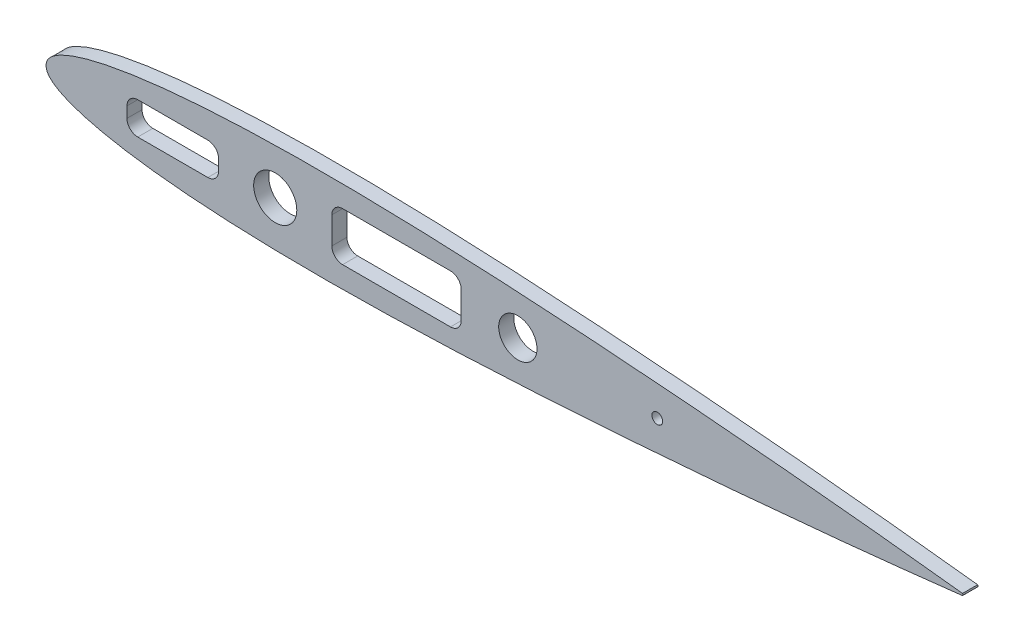
ISO-10303-21;
HEADER;
FILE_DESCRIPTION(('STEP AP214'),'2;1');
FILE_NAME('part.step','',(''),(''),'','','');
FILE_SCHEMA(('AUTOMOTIVE_DESIGN { 1 0 10303 214 1 1 1 1 }'));
ENDSEC;
DATA;
#1=APPLICATION_CONTEXT('core data for automotive mechanical design processes');
#2=APPLICATION_PROTOCOL_DEFINITION('international standard','automotive_design',2000,#1);
#3=PRODUCT_CONTEXT('',#1,'mechanical');
#4=PRODUCT('Part','Part','',(#3));
#5=PRODUCT_RELATED_PRODUCT_CATEGORY('part','',(#4));
#6=PRODUCT_DEFINITION_FORMATION('','',#4);
#7=PRODUCT_DEFINITION_CONTEXT('part definition',#1,'design');
#8=PRODUCT_DEFINITION('design','',#6,#7);
#9=PRODUCT_DEFINITION_SHAPE('','',#8);
#10=(LENGTH_UNIT() NAMED_UNIT(*) SI_UNIT(.MILLI.,.METRE.));
#11=(NAMED_UNIT(*) PLANE_ANGLE_UNIT() SI_UNIT($,.RADIAN.));
#12=(NAMED_UNIT(*) SI_UNIT($,.STERADIAN.) SOLID_ANGLE_UNIT());
#13=UNCERTAINTY_MEASURE_WITH_UNIT(LENGTH_MEASURE(1.E-05),#10,'distance_accuracy_value','');
#14=(GEOMETRIC_REPRESENTATION_CONTEXT(3) GLOBAL_UNCERTAINTY_ASSIGNED_CONTEXT((#13)) GLOBAL_UNIT_ASSIGNED_CONTEXT((#10,
#11,#12)) REPRESENTATION_CONTEXT('',''));
#15=CARTESIAN_POINT('',(0.,0.,0.));
#16=DIRECTION('',(0.,0.,1.));
#17=DIRECTION('',(1.,0.,0.));
#18=AXIS2_PLACEMENT_3D('',#15,#16,#17);
#19=CARTESIAN_POINT('',(163.018484280221,0.,1.4));
#20=DIRECTION('',(-1.,0.,0.));
#21=DIRECTION('',(0.,0.,1.));
#22=AXIS2_PLACEMENT_3D('',#19,#20,#21);
#23=PLANE('',#22);
#24=DIRECTION('',(0.,1.,0.));
#25=VECTOR('',#24,1.);
#26=CARTESIAN_POINT('',(163.018484280221,0.,-1.4));
#27=LINE('',#26,#25);
#28=CARTESIAN_POINT('',(163.018484280221,-2.5,-1.4));
#29=VERTEX_POINT('',#28);
#30=CARTESIAN_POINT('',(163.018484280221,2.5,-1.4));
#31=VERTEX_POINT('',#30);
#32=EDGE_CURVE('E250',#29,#31,#27,.T.);
#33=ORIENTED_EDGE('',*,*,#32,.T.);
#34=DIRECTION('',(0.,0.,-1.));
#35=VECTOR('',#34,1.);
#36=CARTESIAN_POINT('',(163.018484280221,2.5,1.4));
#37=LINE('',#36,#35);
#38=CARTESIAN_POINT('',(163.018484280221,2.5,1.4));
#39=VERTEX_POINT('',#38);
#40=EDGE_CURVE('E11',#39,#31,#37,.T.);
#41=ORIENTED_EDGE('',*,*,#40,.F.);
#42=DIRECTION('',(0.,1.,0.));
#43=VECTOR('',#42,1.);
#44=CARTESIAN_POINT('',(163.018484280221,0.,1.4));
#45=LINE('',#44,#43);
#46=CARTESIAN_POINT('',(163.018484280221,-2.5,1.4));
#47=VERTEX_POINT('',#46);
#48=EDGE_CURVE('E426',#47,#39,#45,.T.);
#49=ORIENTED_EDGE('',*,*,#48,.F.);
#50=DIRECTION('',(0.,0.,-1.));
#51=VECTOR('',#50,1.);
#52=CARTESIAN_POINT('',(163.018484280221,-2.5,1.4));
#53=LINE('',#52,#51);
#54=EDGE_CURVE('E276',#47,#29,#53,.T.);
#55=ORIENTED_EDGE('',*,*,#54,.T.);
#56=EDGE_LOOP('',(#33,#41,#49,#55));
#57=FACE_BOUND('',#56,.T.);
#58=ADVANCED_FACE('F35',(#57),#23,.F.);
#59=CARTESIAN_POINT('',(165.018484280221,2.5,1.4));
#60=DIRECTION('',(0.,0.,-1.));
#61=DIRECTION('',(-1.,0.,0.));
#62=AXIS2_PLACEMENT_3D('',#59,#60,#61);
#63=CYLINDRICAL_SURFACE('',#62,2.);
#64=CARTESIAN_POINT('',(165.018484280221,2.5,-1.4));
#65=DIRECTION('',(0.,0.,1.));
#66=DIRECTION('',(1.,0.,0.));
#67=AXIS2_PLACEMENT_3D('',#64,#65,#66);
#68=CIRCLE('',#67,2.);
#69=CARTESIAN_POINT('',(165.018484280221,4.5,-1.4));
#70=VERTEX_POINT('',#69);
#71=EDGE_CURVE('E253',#31,#70,#68,.F.);
#72=ORIENTED_EDGE('',*,*,#71,.T.);
#73=DIRECTION('',(0.,0.,-1.));
#74=VECTOR('',#73,1.);
#75=CARTESIAN_POINT('',(165.018484280221,4.5,1.4));
#76=LINE('',#75,#74);
#77=CARTESIAN_POINT('',(165.018484280221,4.5,1.4));
#78=VERTEX_POINT('',#77);
#79=EDGE_CURVE('E46',#78,#70,#76,.T.);
#80=ORIENTED_EDGE('',*,*,#79,.F.);
#81=CARTESIAN_POINT('',(165.018484280221,2.5,1.4));
#82=DIRECTION('',(0.,0.,1.));
#83=DIRECTION('',(1.,0.,0.));
#84=AXIS2_PLACEMENT_3D('',#81,#82,#83);
#85=CIRCLE('',#84,2.);
#86=EDGE_CURVE('E428',#39,#78,#85,.F.);
#87=ORIENTED_EDGE('',*,*,#86,.F.);
#88=ORIENTED_EDGE('',*,*,#40,.T.);
#89=EDGE_LOOP('',(#72,#80,#87,#88));
#90=FACE_BOUND('',#89,.T.);
#91=ADVANCED_FACE('F360',(#90),#63,.F.);
#92=CARTESIAN_POINT('',(0.,4.5,1.4));
#93=DIRECTION('',(0.,1.,0.));
#94=DIRECTION('',(0.,0.,1.));
#95=AXIS2_PLACEMENT_3D('',#92,#93,#94);
#96=PLANE('',#95);
#97=DIRECTION('',(1.,0.,0.));
#98=VECTOR('',#97,1.);
#99=CARTESIAN_POINT('',(0.,4.5,-1.4));
#100=LINE('',#99,#98);
#101=CARTESIAN_POINT('',(185.018484280221,4.5,-1.4));
#102=VERTEX_POINT('',#101);
#103=EDGE_CURVE('E255',#70,#102,#100,.T.);
#104=ORIENTED_EDGE('',*,*,#103,.T.);
#105=DIRECTION('',(0.,0.,-1.));
#106=VECTOR('',#105,1.);
#107=CARTESIAN_POINT('',(185.018484280221,4.5,1.4));
#108=LINE('',#107,#106);
#109=CARTESIAN_POINT('',(185.018484280221,4.5,1.4));
#110=VERTEX_POINT('',#109);
#111=EDGE_CURVE('E283',#110,#102,#108,.T.);
#112=ORIENTED_EDGE('',*,*,#111,.F.);
#113=DIRECTION('',(1.,0.,0.));
#114=VECTOR('',#113,1.);
#115=CARTESIAN_POINT('',(0.,4.5,1.4));
#116=LINE('',#115,#114);
#117=EDGE_CURVE('E430',#78,#110,#116,.T.);
#118=ORIENTED_EDGE('',*,*,#117,.F.);
#119=ORIENTED_EDGE('',*,*,#79,.T.);
#120=EDGE_LOOP('',(#104,#112,#118,#119));
#121=FACE_BOUND('',#120,.T.);
#122=ADVANCED_FACE('F366',(#121),#96,.F.);
#123=CARTESIAN_POINT('',(185.018484280221,2.5,1.4));
#124=DIRECTION('',(0.,0.,-1.));
#125=DIRECTION('',(-1.,0.,0.));
#126=AXIS2_PLACEMENT_3D('',#123,#124,#125);
#127=CYLINDRICAL_SURFACE('',#126,2.);
#128=CARTESIAN_POINT('',(185.018484280221,2.5,-1.4));
#129=DIRECTION('',(0.,0.,1.));
#130=DIRECTION('',(1.,0.,0.));
#131=AXIS2_PLACEMENT_3D('',#128,#129,#130);
#132=CIRCLE('',#131,2.);
#133=CARTESIAN_POINT('',(187.018484280221,2.5,-1.4));
#134=VERTEX_POINT('',#133);
#135=EDGE_CURVE('E257',#102,#134,#132,.F.);
#136=ORIENTED_EDGE('',*,*,#135,.T.);
#137=DIRECTION('',(0.,0.,-1.));
#138=VECTOR('',#137,1.);
#139=CARTESIAN_POINT('',(187.018484280221,2.5,1.4));
#140=LINE('',#139,#138);
#141=CARTESIAN_POINT('',(187.018484280221,2.5,1.4));
#142=VERTEX_POINT('',#141);
#143=EDGE_CURVE('E281',#142,#134,#140,.T.);
#144=ORIENTED_EDGE('',*,*,#143,.F.);
#145=CARTESIAN_POINT('',(185.018484280221,2.5,1.4));
#146=DIRECTION('',(0.,0.,1.));
#147=DIRECTION('',(1.,0.,0.));
#148=AXIS2_PLACEMENT_3D('',#145,#146,#147);
#149=CIRCLE('',#148,2.);
#150=EDGE_CURVE('E432',#110,#142,#149,.F.);
#151=ORIENTED_EDGE('',*,*,#150,.F.);
#152=ORIENTED_EDGE('',*,*,#111,.T.);
#153=EDGE_LOOP('',(#136,#144,#151,#152));
#154=FACE_BOUND('',#153,.T.);
#155=ADVANCED_FACE('F457',(#154),#127,.F.);
#156=CARTESIAN_POINT('',(187.018484280221,0.,1.4));
#157=DIRECTION('',(-1.,0.,0.));
#158=DIRECTION('',(0.,0.,1.));
#159=AXIS2_PLACEMENT_3D('',#156,#157,#158);
#160=PLANE('',#159);
#161=DIRECTION('',(0.,1.,0.));
#162=VECTOR('',#161,1.);
#163=CARTESIAN_POINT('',(187.018484280221,0.,-1.4));
#164=LINE('',#163,#162);
#165=CARTESIAN_POINT('',(187.018484280221,-2.5,-1.4));
#166=VERTEX_POINT('',#165);
#167=EDGE_CURVE('E260',#166,#134,#164,.T.);
#168=ORIENTED_EDGE('',*,*,#167,.F.);
#169=DIRECTION('',(0.,0.,-1.));
#170=VECTOR('',#169,1.);
#171=CARTESIAN_POINT('',(187.018484280221,-2.5,1.4));
#172=LINE('',#171,#170);
#173=CARTESIAN_POINT('',(187.018484280221,-2.5,1.4));
#174=VERTEX_POINT('',#173);
#175=EDGE_CURVE('E187',#174,#166,#172,.T.);
#176=ORIENTED_EDGE('',*,*,#175,.F.);
#177=DIRECTION('',(0.,1.,0.));
#178=VECTOR('',#177,1.);
#179=CARTESIAN_POINT('',(187.018484280221,0.,1.4));
#180=LINE('',#179,#178);
#181=EDGE_CURVE('E194',#174,#142,#180,.T.);
#182=ORIENTED_EDGE('',*,*,#181,.T.);
#183=ORIENTED_EDGE('',*,*,#143,.T.);
#184=EDGE_LOOP('',(#168,#176,#182,#183));
#185=FACE_BOUND('',#184,.T.);
#186=ADVANCED_FACE('F435',(#185),#160,.T.);
#187=CARTESIAN_POINT('',(185.018484280221,-2.5,1.4));
#188=DIRECTION('',(0.,0.,-1.));
#189=DIRECTION('',(-1.,0.,0.));
#190=AXIS2_PLACEMENT_3D('',#187,#188,#189);
#191=CYLINDRICAL_SURFACE('',#190,2.);
#192=CARTESIAN_POINT('',(185.018484280221,-2.5,-1.4));
#193=DIRECTION('',(0.,0.,1.));
#194=DIRECTION('',(1.,0.,0.));
#195=AXIS2_PLACEMENT_3D('',#192,#193,#194);
#196=CIRCLE('',#195,2.);
#197=CARTESIAN_POINT('',(185.018484280221,-4.5,-1.4));
#198=VERTEX_POINT('',#197);
#199=EDGE_CURVE('E182',#198,#166,#196,.T.);
#200=ORIENTED_EDGE('',*,*,#199,.F.);
#201=DIRECTION('',(0.,0.,-1.));
#202=VECTOR('',#201,1.);
#203=CARTESIAN_POINT('',(185.018484280221,-4.5,1.4));
#204=LINE('',#203,#202);
#205=CARTESIAN_POINT('',(185.018484280221,-4.5,1.4));
#206=VERTEX_POINT('',#205);
#207=EDGE_CURVE('E177',#206,#198,#204,.T.);
#208=ORIENTED_EDGE('',*,*,#207,.F.);
#209=CARTESIAN_POINT('',(185.018484280221,-2.5,1.4));
#210=DIRECTION('',(0.,0.,1.));
#211=DIRECTION('',(1.,0.,0.));
#212=AXIS2_PLACEMENT_3D('',#209,#210,#211);
#213=CIRCLE('',#212,2.);
#214=EDGE_CURVE('E180',#206,#174,#213,.T.);
#215=ORIENTED_EDGE('',*,*,#214,.T.);
#216=ORIENTED_EDGE('',*,*,#175,.T.);
#217=EDGE_LOOP('',(#200,#208,#215,#216));
#218=FACE_BOUND('',#217,.T.);
#219=ADVANCED_FACE('F179',(#218),#191,.F.);
#220=CARTESIAN_POINT('',(0.,-4.5,1.4));
#221=DIRECTION('',(0.,1.,0.));
#222=DIRECTION('',(0.,0.,1.));
#223=AXIS2_PLACEMENT_3D('',#220,#221,#222);
#224=PLANE('',#223);
#225=DIRECTION('',(1.,0.,0.));
#226=VECTOR('',#225,1.);
#227=CARTESIAN_POINT('',(0.,-4.5,-1.4));
#228=LINE('',#227,#226);
#229=CARTESIAN_POINT('',(165.018484280221,-4.5,-1.4));
#230=VERTEX_POINT('',#229);
#231=EDGE_CURVE('E264',#230,#198,#228,.T.);
#232=ORIENTED_EDGE('',*,*,#231,.F.);
#233=DIRECTION('',(0.,0.,-1.));
#234=VECTOR('',#233,1.);
#235=CARTESIAN_POINT('',(165.018484280221,-4.5,1.4));
#236=LINE('',#235,#234);
#237=CARTESIAN_POINT('',(165.018484280221,-4.5,1.4));
#238=VERTEX_POINT('',#237);
#239=EDGE_CURVE('E116',#238,#230,#236,.T.);
#240=ORIENTED_EDGE('',*,*,#239,.F.);
#241=DIRECTION('',(1.,0.,0.));
#242=VECTOR('',#241,1.);
#243=CARTESIAN_POINT('',(0.,-4.5,1.4));
#244=LINE('',#243,#242);
#245=EDGE_CURVE('E192',#238,#206,#244,.T.);
#246=ORIENTED_EDGE('',*,*,#245,.T.);
#247=ORIENTED_EDGE('',*,*,#207,.T.);
#248=EDGE_LOOP('',(#232,#240,#246,#247));
#249=FACE_BOUND('',#248,.T.);
#250=ADVANCED_FACE('F196',(#249),#224,.T.);
#251=CARTESIAN_POINT('',(0.,3.,1.4));
#252=DIRECTION('',(0.,1.,0.));
#253=DIRECTION('',(0.,0.,1.));
#254=AXIS2_PLACEMENT_3D('',#251,#252,#253);
#255=PLANE('',#254);
#256=DIRECTION('',(1.,0.,0.));
#257=VECTOR('',#256,1.);
#258=CARTESIAN_POINT('',(0.,3.,-1.4));
#259=LINE('',#258,#257);
#260=CARTESIAN_POINT('',(127.018484280221,3.,-1.4));
#261=VERTEX_POINT('',#260);
#262=CARTESIAN_POINT('',(140.018484280221,3.,-1.4));
#263=VERTEX_POINT('',#262);
#264=EDGE_CURVE('E226',#261,#263,#259,.T.);
#265=ORIENTED_EDGE('',*,*,#264,.T.);
#266=DIRECTION('',(0.,0.,-1.));
#267=VECTOR('',#266,1.);
#268=CARTESIAN_POINT('',(140.018484280221,3.,1.4));
#269=LINE('',#268,#267);
#270=CARTESIAN_POINT('',(140.018484280221,3.,1.4));
#271=VERTEX_POINT('',#270);
#272=EDGE_CURVE('E278',#271,#263,#269,.T.);
#273=ORIENTED_EDGE('',*,*,#272,.F.);
#274=DIRECTION('',(1.,0.,0.));
#275=VECTOR('',#274,1.);
#276=CARTESIAN_POINT('',(0.,3.,1.4));
#277=LINE('',#276,#275);
#278=CARTESIAN_POINT('',(127.018484280221,3.,1.4));
#279=VERTEX_POINT('',#278);
#280=EDGE_CURVE('E337',#279,#271,#277,.T.);
#281=ORIENTED_EDGE('',*,*,#280,.F.);
#282=DIRECTION('',(0.,0.,-1.));
#283=VECTOR('',#282,1.);
#284=CARTESIAN_POINT('',(127.018484280221,3.,1.4));
#285=LINE('',#284,#283);
#286=EDGE_CURVE('E288',#279,#261,#285,.T.);
#287=ORIENTED_EDGE('',*,*,#286,.T.);
#288=EDGE_LOOP('',(#265,#273,#281,#287));
#289=FACE_BOUND('',#288,.T.);
#290=ADVANCED_FACE('F347',(#289),#255,.F.);
#291=CARTESIAN_POINT('',(140.018484280221,1.,1.4));
#292=DIRECTION('',(0.,0.,-1.));
#293=DIRECTION('',(-1.,0.,0.));
#294=AXIS2_PLACEMENT_3D('',#291,#292,#293);
#295=CYLINDRICAL_SURFACE('',#294,2.);
#296=CARTESIAN_POINT('',(140.018484280221,1.,-1.4));
#297=DIRECTION('',(0.,0.,1.));
#298=DIRECTION('',(1.,0.,0.));
#299=AXIS2_PLACEMENT_3D('',#296,#297,#298);
#300=CIRCLE('',#299,2.);
#301=CARTESIAN_POINT('',(142.018484280221,0.999999999999986,-1.4));
#302=VERTEX_POINT('',#301);
#303=EDGE_CURVE('E232',#263,#302,#300,.F.);
#304=ORIENTED_EDGE('',*,*,#303,.T.);
#305=DIRECTION('',(0.,0.,-1.));
#306=VECTOR('',#305,1.);
#307=CARTESIAN_POINT('',(142.018484280221,0.999999999999986,1.4));
#308=LINE('',#307,#306);
#309=CARTESIAN_POINT('',(142.018484280221,0.999999999999986,1.4));
#310=VERTEX_POINT('',#309);
#311=EDGE_CURVE('E303',#310,#302,#308,.T.);
#312=ORIENTED_EDGE('',*,*,#311,.F.);
#313=CARTESIAN_POINT('',(140.018484280221,1.,1.4));
#314=DIRECTION('',(0.,0.,1.));
#315=DIRECTION('',(1.,0.,0.));
#316=AXIS2_PLACEMENT_3D('',#313,#314,#315);
#317=CIRCLE('',#316,2.);
#318=EDGE_CURVE('E413',#271,#310,#317,.F.);
#319=ORIENTED_EDGE('',*,*,#318,.F.);
#320=ORIENTED_EDGE('',*,*,#272,.T.);
#321=EDGE_LOOP('',(#304,#312,#319,#320));
#322=FACE_BOUND('',#321,.T.);
#323=ADVANCED_FACE('F392',(#322),#295,.F.);
#324=CARTESIAN_POINT('',(142.018484280221,0.,1.4));
#325=DIRECTION('',(-1.,0.,0.));
#326=DIRECTION('',(0.,0.,1.));
#327=AXIS2_PLACEMENT_3D('',#324,#325,#326);
#328=PLANE('',#327);
#329=DIRECTION('',(0.,1.,0.));
#330=VECTOR('',#329,1.);
#331=CARTESIAN_POINT('',(142.018484280221,0.,-1.4));
#332=LINE('',#331,#330);
#333=CARTESIAN_POINT('',(142.018484280221,-0.999999999999985,-1.4));
#334=VERTEX_POINT('',#333);
#335=EDGE_CURVE('E235',#334,#302,#332,.T.);
#336=ORIENTED_EDGE('',*,*,#335,.F.);
#337=DIRECTION('',(0.,0.,-1.));
#338=VECTOR('',#337,1.);
#339=CARTESIAN_POINT('',(142.018484280221,-0.999999999999985,1.4));
#340=LINE('',#339,#338);
#341=CARTESIAN_POINT('',(142.018484280221,-0.999999999999985,1.4));
#342=VERTEX_POINT('',#341);
#343=EDGE_CURVE('E301',#342,#334,#340,.T.);
#344=ORIENTED_EDGE('',*,*,#343,.F.);
#345=DIRECTION('',(0.,1.,0.));
#346=VECTOR('',#345,1.);
#347=CARTESIAN_POINT('',(142.018484280221,0.,1.4));
#348=LINE('',#347,#346);
#349=EDGE_CURVE('E408',#342,#310,#348,.T.);
#350=ORIENTED_EDGE('',*,*,#349,.T.);
#351=ORIENTED_EDGE('',*,*,#311,.T.);
#352=EDGE_LOOP('',(#336,#344,#350,#351));
#353=FACE_BOUND('',#352,.T.);
#354=ADVANCED_FACE('F389',(#353),#328,.T.);
#355=CARTESIAN_POINT('',(140.018484280221,-1.,1.4));
#356=DIRECTION('',(0.,0.,-1.));
#357=DIRECTION('',(-1.,0.,0.));
#358=AXIS2_PLACEMENT_3D('',#355,#356,#357);
#359=CYLINDRICAL_SURFACE('',#358,2.);
#360=CARTESIAN_POINT('',(140.018484280221,-1.,-1.4));
#361=DIRECTION('',(0.,0.,1.));
#362=DIRECTION('',(1.,0.,0.));
#363=AXIS2_PLACEMENT_3D('',#360,#361,#362);
#364=CIRCLE('',#363,2.);
#365=CARTESIAN_POINT('',(140.018484280221,-3.,-1.4));
#366=VERTEX_POINT('',#365);
#367=EDGE_CURVE('E238',#366,#334,#364,.T.);
#368=ORIENTED_EDGE('',*,*,#367,.F.);
#369=DIRECTION('',(0.,0.,-1.));
#370=VECTOR('',#369,1.);
#371=CARTESIAN_POINT('',(140.018484280221,-3.,1.4));
#372=LINE('',#371,#370);
#373=CARTESIAN_POINT('',(140.018484280221,-3.,1.4));
#374=VERTEX_POINT('',#373);
#375=EDGE_CURVE('E299',#374,#366,#372,.T.);
#376=ORIENTED_EDGE('',*,*,#375,.F.);
#377=CARTESIAN_POINT('',(140.018484280221,-1.,1.4));
#378=DIRECTION('',(0.,0.,1.));
#379=DIRECTION('',(1.,0.,0.));
#380=AXIS2_PLACEMENT_3D('',#377,#378,#379);
#381=CIRCLE('',#380,2.);
#382=EDGE_CURVE('E412',#374,#342,#381,.T.);
#383=ORIENTED_EDGE('',*,*,#382,.T.);
#384=ORIENTED_EDGE('',*,*,#343,.T.);
#385=EDGE_LOOP('',(#368,#376,#383,#384));
#386=FACE_BOUND('',#385,.T.);
#387=ADVANCED_FACE('F385',(#386),#359,.F.);
#388=CARTESIAN_POINT('',(0.,-3.,1.4));
#389=DIRECTION('',(0.,1.,0.));
#390=DIRECTION('',(0.,0.,1.));
#391=AXIS2_PLACEMENT_3D('',#388,#389,#390);
#392=PLANE('',#391);
#393=DIRECTION('',(1.,0.,0.));
#394=VECTOR('',#393,1.);
#395=CARTESIAN_POINT('',(0.,-3.,-1.4));
#396=LINE('',#395,#394);
#397=CARTESIAN_POINT('',(127.018484280221,-3.,-1.4));
#398=VERTEX_POINT('',#397);
#399=EDGE_CURVE('E241',#398,#366,#396,.T.);
#400=ORIENTED_EDGE('',*,*,#399,.F.);
#401=DIRECTION('',(0.,0.,-1.));
#402=VECTOR('',#401,1.);
#403=CARTESIAN_POINT('',(127.018484280221,-3.,1.4));
#404=LINE('',#403,#402);
#405=CARTESIAN_POINT('',(127.018484280221,-3.,1.4));
#406=VERTEX_POINT('',#405);
#407=EDGE_CURVE('E297',#406,#398,#404,.T.);
#408=ORIENTED_EDGE('',*,*,#407,.F.);
#409=DIRECTION('',(1.,0.,0.));
#410=VECTOR('',#409,1.);
#411=CARTESIAN_POINT('',(0.,-3.,1.4));
#412=LINE('',#411,#410);
#413=EDGE_CURVE('E415',#406,#374,#412,.T.);
#414=ORIENTED_EDGE('',*,*,#413,.T.);
#415=ORIENTED_EDGE('',*,*,#375,.T.);
#416=EDGE_LOOP('',(#400,#408,#414,#415));
#417=FACE_BOUND('',#416,.T.);
#418=ADVANCED_FACE('F381',(#417),#392,.T.);
#419=CARTESIAN_POINT('',(127.018484280221,-1.,1.4));
#420=DIRECTION('',(0.,0.,-1.));
#421=DIRECTION('',(-1.,0.,0.));
#422=AXIS2_PLACEMENT_3D('',#419,#420,#421);
#423=CYLINDRICAL_SURFACE('',#422,2.);
#424=CARTESIAN_POINT('',(127.018484280221,-1.,-1.4));
#425=DIRECTION('',(0.,0.,1.));
#426=DIRECTION('',(1.,0.,0.));
#427=AXIS2_PLACEMENT_3D('',#424,#425,#426);
#428=CIRCLE('',#427,2.);
#429=CARTESIAN_POINT('',(125.018484280221,-0.999999999999985,-1.4));
#430=VERTEX_POINT('',#429);
#431=EDGE_CURVE('E244',#398,#430,#428,.F.);
#432=ORIENTED_EDGE('',*,*,#431,.T.);
#433=DIRECTION('',(0.,0.,-1.));
#434=VECTOR('',#433,1.);
#435=CARTESIAN_POINT('',(125.018484280221,-0.999999999999985,1.4));
#436=LINE('',#435,#434);
#437=CARTESIAN_POINT('',(125.018484280221,-0.999999999999985,1.4));
#438=VERTEX_POINT('',#437);
#439=EDGE_CURVE('E294',#438,#430,#436,.T.);
#440=ORIENTED_EDGE('',*,*,#439,.F.);
#441=CARTESIAN_POINT('',(127.018484280221,-1.,1.4));
#442=DIRECTION('',(0.,0.,1.));
#443=DIRECTION('',(1.,0.,0.));
#444=AXIS2_PLACEMENT_3D('',#441,#442,#443);
#445=CIRCLE('',#444,2.);
#446=EDGE_CURVE('E420',#406,#438,#445,.F.);
#447=ORIENTED_EDGE('',*,*,#446,.F.);
#448=ORIENTED_EDGE('',*,*,#407,.T.);
#449=EDGE_LOOP('',(#432,#440,#447,#448));
#450=FACE_BOUND('',#449,.T.);
#451=ADVANCED_FACE('F377',(#450),#423,.F.);
#452=CARTESIAN_POINT('',(125.018484280221,0.,1.4));
#453=DIRECTION('',(-1.,0.,0.));
#454=DIRECTION('',(0.,0.,1.));
#455=AXIS2_PLACEMENT_3D('',#452,#453,#454);
#456=PLANE('',#455);
#457=DIRECTION('',(0.,1.,0.));
#458=VECTOR('',#457,1.);
#459=CARTESIAN_POINT('',(125.018484280221,0.,-1.4));
#460=LINE('',#459,#458);
#461=CARTESIAN_POINT('',(125.018484280221,0.999999999999986,-1.4));
#462=VERTEX_POINT('',#461);
#463=EDGE_CURVE('E246',#430,#462,#460,.T.);
#464=ORIENTED_EDGE('',*,*,#463,.T.);
#465=DIRECTION('',(0.,0.,-1.));
#466=VECTOR('',#465,1.);
#467=CARTESIAN_POINT('',(125.018484280221,0.999999999999986,1.4));
#468=LINE('',#467,#466);
#469=CARTESIAN_POINT('',(125.018484280221,0.999999999999986,1.4));
#470=VERTEX_POINT('',#469);
#471=EDGE_CURVE('E291',#470,#462,#468,.T.);
#472=ORIENTED_EDGE('',*,*,#471,.F.);
#473=DIRECTION('',(0.,1.,0.));
#474=VECTOR('',#473,1.);
#475=CARTESIAN_POINT('',(125.018484280221,0.,1.4));
#476=LINE('',#475,#474);
#477=EDGE_CURVE('E422',#438,#470,#476,.T.);
#478=ORIENTED_EDGE('',*,*,#477,.F.);
#479=ORIENTED_EDGE('',*,*,#439,.T.);
#480=EDGE_LOOP('',(#464,#472,#478,#479));
#481=FACE_BOUND('',#480,.T.);
#482=ADVANCED_FACE('F358',(#481),#456,.F.);
#483=CARTESIAN_POINT('',(110.,0.,1.4));
#484=CARTESIAN_POINT('',(110.027578175867,-0.236721440142772,1.4));
#485=CARTESIAN_POINT('',(110.085538217979,-0.734230220465975,1.4));
#486=CARTESIAN_POINT('',(110.530223641577,-1.42706975809109,1.4));
#487=CARTESIAN_POINT('',(111.196336340545,-2.07855523302878,1.4));
#488=CARTESIAN_POINT('',(112.109835923497,-2.70130638754161,1.4));
#489=CARTESIAN_POINT('',(113.256788366372,-3.29930923783809,1.4));
#490=CARTESIAN_POINT('',(114.637939719778,-3.87306046577258,1.4));
#491=CARTESIAN_POINT('',(116.24766579781,-4.42139238611828,1.4));
#492=CARTESIAN_POINT('',(118.081312132678,-4.94256764101073,1.4));
#493=CARTESIAN_POINT('',(120.133109351335,-5.43479747619412,1.4));
#494=CARTESIAN_POINT('',(122.397158973637,-5.89612056643677,1.4));
#495=CARTESIAN_POINT('',(124.867245825052,-6.32466607739586,1.4));
#496=CARTESIAN_POINT('',(127.536961088608,-6.71865034112428,1.4));
#497=CARTESIAN_POINT('',(130.399721685833,-7.07642431038863,1.4));
#498=CARTESIAN_POINT('',(133.44876289533,-7.39648056861162,1.4));
#499=CARTESIAN_POINT('',(136.677139412155,-7.67760454203032,1.4));
#500=CARTESIAN_POINT('',(140.077743555427,-7.91867894287145,1.4));
#501=CARTESIAN_POINT('',(143.643266298458,-8.11897556141504,1.4));
#502=CARTESIAN_POINT('',(147.366223919106,-8.27798597685019,1.4));
#503=CARTESIAN_POINT('',(151.238917925322,-8.39550607585732,1.4));
#504=CARTESIAN_POINT('',(155.253439755899,-8.47152880790102,1.4));
#505=CARTESIAN_POINT('',(159.401643403725,-8.50652296727325,1.4));
#506=CARTESIAN_POINT('',(163.675147454163,-8.5010026998616,1.4));
#507=CARTESIAN_POINT('',(168.065295924147,-8.45595366245417,1.4));
#508=CARTESIAN_POINT('',(172.563150271755,-8.37248656398386,1.4));
#509=CARTESIAN_POINT('',(177.159453511195,-8.25195768192942,1.4));
#510=CARTESIAN_POINT('',(181.844626933159,-8.09595849303594,1.4));
#511=CARTESIAN_POINT('',(186.60870012693,-7.90621829286941,1.4));
#512=CARTESIAN_POINT('',(191.441311474098,-7.68460443906704,1.4));
#513=CARTESIAN_POINT('',(196.331634567492,-7.43310533690328,1.4));
#514=CARTESIAN_POINT('',(201.268368916985,-7.15382688632495,1.4));
#515=CARTESIAN_POINT('',(206.239642946259,-6.84887299963153,1.4));
#516=CARTESIAN_POINT('',(211.232977593233,-6.52047434958792,1.4));
#517=CARTESIAN_POINT('',(216.235178286271,-6.17086457697306,1.4));
#518=CARTESIAN_POINT('',(221.232257466585,-5.802244474926,1.4));
#519=CARTESIAN_POINT('',(226.209311113548,-5.41695826474113,1.4));
#520=CARTESIAN_POINT('',(231.150377302515,-5.0173511026198,1.4));
#521=CARTESIAN_POINT('',(236.038226964104,-4.60581174883637,1.4));
#522=CARTESIAN_POINT('',(240.854179313273,-4.18491264898859,1.4));
#523=CARTESIAN_POINT('',(247.071089235748,-3.62220530992837,1.4));
#524=CARTESIAN_POINT('',(253.11611192075,-3.04786904369115,1.4));
#525=CARTESIAN_POINT('',(258.952644661846,-2.46718813772147,1.4));
#526=CARTESIAN_POINT('',(263.047743378214,-2.04785660385741,1.4));
#527=CARTESIAN_POINT('',(266.898988861825,-1.64260730411104,1.4));
#528=CARTESIAN_POINT('',(270.455833183168,-1.25859090467058,1.4));
#529=CARTESIAN_POINT('',(273.651166983567,-0.905304265461349,1.4));
#530=CARTESIAN_POINT('',(276.385426802208,-0.59643648193733,1.4));
#531=CARTESIAN_POINT('',(278.452596210234,-0.358958360844466,1.4));
#532=CARTESIAN_POINT('',(279.592043703671,-0.226075897783468,1.4));
#533=CARTESIAN_POINT('',(280.,-0.1785,1.4));
#534=B_SPLINE_CURVE_WITH_KNOTS('',3,(#483,#484,#485,#486,#487,#488,#489,#490,#491,#492,#493,
#494,#495,#496,#497,#498,#499,#500,#501,#502,#503,#504,#505,#506,#507,#508,#509,#510,#511,#512,
#513,#514,#515,#516,#517,#518,#519,#520,#521,#522,#523,#524,#525,#526,#527,#528,#529,#530,#531,
#532,#533),.UNSPECIFIED.,.F.,.F.,(4,1,1,1,1,1,1,1,1,1,1,1,1,1,1,1,1,1,1,1,1,1,1,1,1,1,1,1,1,1,1,
1,1,1,1,1,1,1,1,1,1,1,1,1,1,1,1,1,4),(0.,0.00409901119627066,0.00861474169622249,
0.013934854724959,0.0202777746115639,0.0277529807018305,0.0364102145151919,0.0462664329749759,
0.057320237837208,0.0695589461393541,0.0829628608595683,0.0975072182865541,0.113164081930894,
0.129902689855954,0.147690303906216,0.166492184642367,0.186271967143026,0.206991861424858,
0.228612214931177,0.25109216492606,0.274388983443375,0.298458209116087,0.323253842050884,
0.348727970896163,0.374830386774719,0.401509190431855,0.428710015672103,0.456376153594157,
0.484448082863221,0.512863886613239,0.541558094079446,0.570462312854758,0.599504247573885,
0.628607348748546,0.657690446050344,0.68666723740018,0.715444848929875,0.743923546361862,
0.771994829811623,0.799540252867686,0.852512114582347,0.877624445997917,0.901571133904992,
0.924121062493777,0.944988816236938,0.963803938777258,0.980044339265455,0.992855276358985,1.),.UNSPECIFIED.);
#535=DIRECTION('',(0.,0.,-1.));
#536=VECTOR('',#535,1.);
#537=SURFACE_OF_LINEAR_EXTRUSION('',#534,#536);
#538=CARTESIAN_POINT('',(110.,0.,-1.4));
#539=CARTESIAN_POINT('',(110.027578175867,-0.236721440142772,-1.4));
#540=CARTESIAN_POINT('',(110.085538217979,-0.734230220465975,-1.4));
#541=CARTESIAN_POINT('',(110.530223641577,-1.42706975809109,-1.4));
#542=CARTESIAN_POINT('',(111.196336340545,-2.07855523302878,-1.4));
#543=CARTESIAN_POINT('',(112.109835923497,-2.70130638754161,-1.4));
#544=CARTESIAN_POINT('',(113.256788366372,-3.29930923783809,-1.4));
#545=CARTESIAN_POINT('',(114.637939719778,-3.87306046577258,-1.4));
#546=CARTESIAN_POINT('',(116.24766579781,-4.42139238611828,-1.4));
#547=CARTESIAN_POINT('',(118.081312132678,-4.94256764101073,-1.4));
#548=CARTESIAN_POINT('',(120.133109351335,-5.43479747619412,-1.4));
#549=CARTESIAN_POINT('',(122.397158973637,-5.89612056643677,-1.4));
#550=CARTESIAN_POINT('',(124.867245825052,-6.32466607739586,-1.4));
#551=CARTESIAN_POINT('',(127.536961088608,-6.71865034112428,-1.4));
#552=CARTESIAN_POINT('',(130.399721685833,-7.07642431038863,-1.4));
#553=CARTESIAN_POINT('',(133.44876289533,-7.39648056861162,-1.4));
#554=CARTESIAN_POINT('',(136.677139412155,-7.67760454203032,-1.4));
#555=CARTESIAN_POINT('',(140.077743555427,-7.91867894287145,-1.4));
#556=CARTESIAN_POINT('',(143.643266298458,-8.11897556141504,-1.4));
#557=CARTESIAN_POINT('',(147.366223919106,-8.27798597685019,-1.4));
#558=CARTESIAN_POINT('',(151.238917925322,-8.39550607585732,-1.4));
#559=CARTESIAN_POINT('',(155.253439755899,-8.47152880790102,-1.4));
#560=CARTESIAN_POINT('',(159.401643403725,-8.50652296727325,-1.4));
#561=CARTESIAN_POINT('',(163.675147454163,-8.5010026998616,-1.4));
#562=CARTESIAN_POINT('',(168.065295924147,-8.45595366245417,-1.4));
#563=CARTESIAN_POINT('',(172.563150271755,-8.37248656398386,-1.4));
#564=CARTESIAN_POINT('',(177.159453511195,-8.25195768192942,-1.4));
#565=CARTESIAN_POINT('',(181.844626933159,-8.09595849303594,-1.4));
#566=CARTESIAN_POINT('',(186.60870012693,-7.90621829286941,-1.4));
#567=CARTESIAN_POINT('',(191.441311474098,-7.68460443906704,-1.4));
#568=CARTESIAN_POINT('',(196.331634567492,-7.43310533690328,-1.4));
#569=CARTESIAN_POINT('',(201.268368916985,-7.15382688632495,-1.4));
#570=CARTESIAN_POINT('',(206.239642946259,-6.84887299963153,-1.4));
#571=CARTESIAN_POINT('',(211.232977593233,-6.52047434958792,-1.4));
#572=CARTESIAN_POINT('',(216.235178286271,-6.17086457697306,-1.4));
#573=CARTESIAN_POINT('',(221.232257466585,-5.802244474926,-1.4));
#574=CARTESIAN_POINT('',(226.209311113548,-5.41695826474113,-1.4));
#575=CARTESIAN_POINT('',(231.150377302515,-5.0173511026198,-1.4));
#576=CARTESIAN_POINT('',(236.038226964104,-4.60581174883637,-1.4));
#577=CARTESIAN_POINT('',(240.854179313273,-4.18491264898859,-1.4));
#578=CARTESIAN_POINT('',(247.071089235748,-3.62220530992837,-1.4));
#579=CARTESIAN_POINT('',(253.11611192075,-3.04786904369115,-1.4));
#580=CARTESIAN_POINT('',(258.952644661846,-2.46718813772147,-1.4));
#581=CARTESIAN_POINT('',(263.047743378214,-2.04785660385741,-1.4));
#582=CARTESIAN_POINT('',(266.898988861825,-1.64260730411104,-1.4));
#583=CARTESIAN_POINT('',(270.455833183168,-1.25859090467058,-1.4));
#584=CARTESIAN_POINT('',(273.651166983567,-0.905304265461349,-1.4));
#585=CARTESIAN_POINT('',(276.385426802208,-0.59643648193733,-1.4));
#586=CARTESIAN_POINT('',(278.452596210234,-0.358958360844466,-1.4));
#587=CARTESIAN_POINT('',(279.592043703671,-0.226075897783468,-1.4));
#588=CARTESIAN_POINT('',(280.,-0.1785,-1.4));
#589=B_SPLINE_CURVE_WITH_KNOTS('',3,(#538,#539,#540,#541,#542,#543,#544,#545,#546,#547,#548,
#549,#550,#551,#552,#553,#554,#555,#556,#557,#558,#559,#560,#561,#562,#563,#564,#565,#566,#567,
#568,#569,#570,#571,#572,#573,#574,#575,#576,#577,#578,#579,#580,#581,#582,#583,#584,#585,#586,
#587,#588),.UNSPECIFIED.,.F.,.F.,(4,1,1,1,1,1,1,1,1,1,1,1,1,1,1,1,1,1,1,1,1,1,1,1,1,1,1,1,1,1,1,
1,1,1,1,1,1,1,1,1,1,1,1,1,1,1,1,1,4),(0.,0.00409901119627066,0.00861474169622249,
0.013934854724959,0.0202777746115639,0.0277529807018305,0.0364102145151919,0.0462664329749759,
0.057320237837208,0.0695589461393541,0.0829628608595683,0.0975072182865541,0.113164081930894,
0.129902689855954,0.147690303906216,0.166492184642367,0.186271967143026,0.206991861424858,
0.228612214931177,0.25109216492606,0.274388983443375,0.298458209116087,0.323253842050884,
0.348727970896163,0.374830386774719,0.401509190431855,0.428710015672103,0.456376153594157,
0.484448082863221,0.512863886613239,0.541558094079446,0.570462312854758,0.599504247573885,
0.628607348748546,0.657690446050344,0.68666723740018,0.715444848929875,0.743923546361862,
0.771994829811623,0.799540252867686,0.852512114582347,0.877624445997917,0.901571133904992,
0.924121062493777,0.944988816236938,0.963803938777258,0.980044339265455,0.992855276358985,1.),.UNSPECIFIED.);
#590=CARTESIAN_POINT('',(110.,0.,-1.4));
#591=VERTEX_POINT('',#590);
#592=CARTESIAN_POINT('',(280.,-0.1785,-1.4));
#593=VERTEX_POINT('',#592);
#594=EDGE_CURVE('E211',#591,#593,#589,.T.);
#595=ORIENTED_EDGE('',*,*,#594,.T.);
#596=DIRECTION('',(0.,0.,-1.));
#597=VECTOR('',#596,1.);
#598=CARTESIAN_POINT('',(280.,-0.1785,1.4));
#599=LINE('',#598,#597);
#600=CARTESIAN_POINT('',(280.,-0.1785,1.4));
#601=VERTEX_POINT('',#600);
#602=EDGE_CURVE('E40',#601,#593,#599,.T.);
#603=ORIENTED_EDGE('',*,*,#602,.F.);
#604=CARTESIAN_POINT('',(110.,0.,1.4));
#605=VERTEX_POINT('',#604);
#606=EDGE_CURVE('E128',#605,#601,#534,.T.);
#607=ORIENTED_EDGE('',*,*,#606,.F.);
#608=DIRECTION('',(0.,0.,-1.));
#609=VECTOR('',#608,1.);
#610=CARTESIAN_POINT('',(110.,0.,1.4));
#611=LINE('',#610,#609);
#612=EDGE_CURVE('E210',#605,#591,#611,.T.);
#613=ORIENTED_EDGE('',*,*,#612,.T.);
#614=EDGE_LOOP('',(#595,#603,#607,#613));
#615=FACE_BOUND('',#614,.T.);
#616=ADVANCED_FACE('F37',(#615),#537,.F.);
#617=CARTESIAN_POINT('',(279.8215,0.,1.4));
#618=DIRECTION('',(0.,0.,-1.));
#619=DIRECTION('',(-1.,0.,0.));
#620=AXIS2_PLACEMENT_3D('',#617,#618,#619);
#621=CYLINDRICAL_SURFACE('',#620,0.252437120883675);
#622=CARTESIAN_POINT('',(279.8215,0.,-1.4));
#623=DIRECTION('',(0.,0.,1.));
#624=DIRECTION('',(1.,0.,0.));
#625=AXIS2_PLACEMENT_3D('',#622,#623,#624);
#626=CIRCLE('',#625,0.252437120883675);
#627=CARTESIAN_POINT('',(280.,0.1785,-1.4));
#628=VERTEX_POINT('',#627);
#629=EDGE_CURVE('E216',#628,#593,#626,.F.);
#630=ORIENTED_EDGE('',*,*,#629,.F.);
#631=DIRECTION('',(0.,0.,-1.));
#632=VECTOR('',#631,1.);
#633=CARTESIAN_POINT('',(280.,0.1785,1.4));
#634=LINE('',#633,#632);
#635=CARTESIAN_POINT('',(280.,0.1785,1.4));
#636=VERTEX_POINT('',#635);
#637=EDGE_CURVE('E308',#636,#628,#634,.T.);
#638=ORIENTED_EDGE('',*,*,#637,.F.);
#639=CARTESIAN_POINT('',(279.8215,0.,1.4));
#640=DIRECTION('',(0.,0.,1.));
#641=DIRECTION('',(1.,0.,0.));
#642=AXIS2_PLACEMENT_3D('',#639,#640,#641);
#643=CIRCLE('',#642,0.252437120883675);
#644=EDGE_CURVE('E316',#636,#601,#643,.F.);
#645=ORIENTED_EDGE('',*,*,#644,.T.);
#646=ORIENTED_EDGE('',*,*,#602,.T.);
#647=EDGE_LOOP('',(#630,#638,#645,#646));
#648=FACE_BOUND('',#647,.T.);
#649=ADVANCED_FACE('F315',(#648),#621,.T.);
#650=CARTESIAN_POINT('',(197.518484280221,0.,1.4));
#651=DIRECTION('',(0.,0.,-1.));
#652=DIRECTION('',(-1.,0.,0.));
#653=AXIS2_PLACEMENT_3D('',#650,#651,#652);
#654=CYLINDRICAL_SURFACE('',#653,3.54999999999999);
#655=CARTESIAN_POINT('',(197.518484280221,0.,1.4));
#656=DIRECTION('',(0.,0.,1.));
#657=DIRECTION('',(1.,0.,0.));
#658=AXIS2_PLACEMENT_3D('',#655,#656,#657);
#659=CIRCLE('',#658,3.54999999999999);
#660=CARTESIAN_POINT('',(201.068484280221,0.,1.4));
#661=VERTEX_POINT('',#660);
#662=EDGE_CURVE('E204',#661,#661,#659,.T.);
#663=ORIENTED_EDGE('',*,*,#662,.T.);
#664=EDGE_LOOP('',(#663));
#665=FACE_BOUND('',#664,.T.);
#666=CARTESIAN_POINT('',(197.518484280221,0.,-1.4));
#667=DIRECTION('',(0.,0.,1.));
#668=DIRECTION('',(1.,0.,0.));
#669=AXIS2_PLACEMENT_3D('',#666,#667,#668);
#670=CIRCLE('',#669,3.54999999999999);
#671=CARTESIAN_POINT('',(201.068484280221,0.,-1.4));
#672=VERTEX_POINT('',#671);
#673=EDGE_CURVE('E270',#672,#672,#670,.T.);
#674=ORIENTED_EDGE('',*,*,#673,.F.);
#675=EDGE_LOOP('',(#674));
#676=FACE_BOUND('',#675,.T.);
#677=ADVANCED_FACE('F350',(#665,#676),#654,.F.);
#678=CARTESIAN_POINT('',(152.518484280221,0.,1.4));
#679=DIRECTION('',(0.,0.,-1.));
#680=DIRECTION('',(-1.,0.,0.));
#681=AXIS2_PLACEMENT_3D('',#678,#679,#680);
#682=CYLINDRICAL_SURFACE('',#681,3.99999999999999);
#683=CARTESIAN_POINT('',(152.518484280221,0.,1.4));
#684=DIRECTION('',(0.,0.,1.));
#685=DIRECTION('',(1.,0.,0.));
#686=AXIS2_PLACEMENT_3D('',#683,#684,#685);
#687=CIRCLE('',#686,3.99999999999999);
#688=CARTESIAN_POINT('',(156.518484280221,0.,1.4));
#689=VERTEX_POINT('',#688);
#690=EDGE_CURVE('E198',#689,#689,#687,.T.);
#691=ORIENTED_EDGE('',*,*,#690,.T.);
#692=EDGE_LOOP('',(#691));
#693=FACE_BOUND('',#692,.T.);
#694=CARTESIAN_POINT('',(152.518484280221,0.,-1.4));
#695=DIRECTION('',(0.,0.,1.));
#696=DIRECTION('',(1.,0.,0.));
#697=AXIS2_PLACEMENT_3D('',#694,#695,#696);
#698=CIRCLE('',#697,3.99999999999999);
#699=CARTESIAN_POINT('',(156.518484280221,0.,-1.4));
#700=VERTEX_POINT('',#699);
#701=EDGE_CURVE('E267',#700,#700,#698,.T.);
#702=ORIENTED_EDGE('',*,*,#701,.F.);
#703=EDGE_LOOP('',(#702));
#704=FACE_BOUND('',#703,.T.);
#705=ADVANCED_FACE('F355',(#693,#704),#682,.F.);
#706=CARTESIAN_POINT('',(165.018484280221,-2.5,1.4));
#707=DIRECTION('',(0.,0.,-1.));
#708=DIRECTION('',(-1.,0.,0.));
#709=AXIS2_PLACEMENT_3D('',#706,#707,#708);
#710=CYLINDRICAL_SURFACE('',#709,2.);
#711=CARTESIAN_POINT('',(165.018484280221,-2.5,-1.4));
#712=DIRECTION('',(0.,0.,1.));
#713=DIRECTION('',(1.,0.,0.));
#714=AXIS2_PLACEMENT_3D('',#711,#712,#713);
#715=CIRCLE('',#714,2.);
#716=EDGE_CURVE('E119',#230,#29,#715,.F.);
#717=ORIENTED_EDGE('',*,*,#716,.T.);
#718=ORIENTED_EDGE('',*,*,#54,.F.);
#719=CARTESIAN_POINT('',(165.018484280221,-2.5,1.4));
#720=DIRECTION('',(0.,0.,1.));
#721=DIRECTION('',(1.,0.,0.));
#722=AXIS2_PLACEMENT_3D('',#719,#720,#721);
#723=CIRCLE('',#722,2.);
#724=EDGE_CURVE('E55',#238,#47,#723,.F.);
#725=ORIENTED_EDGE('',*,*,#724,.F.);
#726=ORIENTED_EDGE('',*,*,#239,.T.);
#727=EDGE_LOOP('',(#717,#718,#725,#726));
#728=FACE_BOUND('',#727,.T.);
#729=ADVANCED_FACE('F373',(#728),#710,.F.);
#730=CARTESIAN_POINT('',(127.018484280221,1.,1.4));
#731=DIRECTION('',(0.,0.,-1.));
#732=DIRECTION('',(-1.,0.,0.));
#733=AXIS2_PLACEMENT_3D('',#730,#731,#732);
#734=CYLINDRICAL_SURFACE('',#733,2.);
#735=CARTESIAN_POINT('',(127.018484280221,1.,-1.4));
#736=DIRECTION('',(0.,0.,1.));
#737=DIRECTION('',(1.,0.,0.));
#738=AXIS2_PLACEMENT_3D('',#735,#736,#737);
#739=CIRCLE('',#738,2.);
#740=EDGE_CURVE('E248',#462,#261,#739,.F.);
#741=ORIENTED_EDGE('',*,*,#740,.T.);
#742=ORIENTED_EDGE('',*,*,#286,.F.);
#743=CARTESIAN_POINT('',(127.018484280221,1.,1.4));
#744=DIRECTION('',(0.,0.,1.));
#745=DIRECTION('',(1.,0.,0.));
#746=AXIS2_PLACEMENT_3D('',#743,#744,#745);
#747=CIRCLE('',#746,2.);
#748=EDGE_CURVE('E424',#470,#279,#747,.F.);
#749=ORIENTED_EDGE('',*,*,#748,.F.);
#750=ORIENTED_EDGE('',*,*,#471,.T.);
#751=EDGE_LOOP('',(#741,#742,#749,#750));
#752=FACE_BOUND('',#751,.T.);
#753=ADVANCED_FACE('F346',(#752),#734,.F.);
#754=CARTESIAN_POINT('',(280.,0.1785,1.4));
#755=CARTESIAN_POINT('',(279.592043703671,0.226075897783467,1.4));
#756=CARTESIAN_POINT('',(278.452596210234,0.358958360844463,1.4));
#757=CARTESIAN_POINT('',(276.385426802208,0.596436481937331,1.4));
#758=CARTESIAN_POINT('',(273.651166983567,0.905304265461348,1.4));
#759=CARTESIAN_POINT('',(270.455833183168,1.25859090467058,1.4));
#760=CARTESIAN_POINT('',(266.898988861825,1.64260730411104,1.4));
#761=CARTESIAN_POINT('',(263.047743378214,2.04785660385741,1.4));
#762=CARTESIAN_POINT('',(258.952644661846,2.46718813772148,1.4));
#763=CARTESIAN_POINT('',(253.11611192075,3.04786904369115,1.4));
#764=CARTESIAN_POINT('',(247.071089235748,3.62220530992837,1.4));
#765=CARTESIAN_POINT('',(240.854179313273,4.18491264898859,1.4));
#766=CARTESIAN_POINT('',(236.038226964104,4.60581174883637,1.4));
#767=CARTESIAN_POINT('',(231.150377302514,5.0173511026198,1.4));
#768=CARTESIAN_POINT('',(226.209311113549,5.41695826474113,1.4));
#769=CARTESIAN_POINT('',(221.232257466585,5.802244474926,1.4));
#770=CARTESIAN_POINT('',(216.235178286272,6.17086457697306,1.4));
#771=CARTESIAN_POINT('',(211.232977593233,6.52047434958791,1.4));
#772=CARTESIAN_POINT('',(206.239642946259,6.84887299963153,1.4));
#773=CARTESIAN_POINT('',(201.268368916985,7.15382688632495,1.4));
#774=CARTESIAN_POINT('',(196.331634567492,7.43310533690328,1.4));
#775=CARTESIAN_POINT('',(191.441311474098,7.68460443906704,1.4));
#776=CARTESIAN_POINT('',(186.608700126931,7.90621829286941,1.4));
#777=CARTESIAN_POINT('',(181.844626933159,8.09595849303594,1.4));
#778=CARTESIAN_POINT('',(177.159453511195,8.25195768192942,1.4));
#779=CARTESIAN_POINT('',(172.563150271755,8.37248656398387,1.4));
#780=CARTESIAN_POINT('',(168.065295924147,8.45595366245417,1.4));
#781=CARTESIAN_POINT('',(163.675147454163,8.5010026998616,1.4));
#782=CARTESIAN_POINT('',(159.401643403725,8.50652296727326,1.4));
#783=CARTESIAN_POINT('',(155.253439755899,8.47152880790102,1.4));
#784=CARTESIAN_POINT('',(151.238917925322,8.39550607585732,1.4));
#785=CARTESIAN_POINT('',(147.366223919106,8.27798597685019,1.4));
#786=CARTESIAN_POINT('',(143.643266298458,8.11897556141504,1.4));
#787=CARTESIAN_POINT('',(140.077743555427,7.91867894287145,1.4));
#788=CARTESIAN_POINT('',(136.677139412155,7.67760454203032,1.4));
#789=CARTESIAN_POINT('',(133.44876289533,7.39648056861162,1.4));
#790=CARTESIAN_POINT('',(130.399721685833,7.07642431038863,1.4));
#791=CARTESIAN_POINT('',(127.536961088608,6.71865034112428,1.4));
#792=CARTESIAN_POINT('',(124.867245825052,6.32466607739586,1.4));
#793=CARTESIAN_POINT('',(122.397158973637,5.89612056643678,1.4));
#794=CARTESIAN_POINT('',(120.133109351335,5.43479747619412,1.4));
#795=CARTESIAN_POINT('',(118.081312132678,4.94256764101073,1.4));
#796=CARTESIAN_POINT('',(116.247665797811,4.42139238611828,1.4));
#797=CARTESIAN_POINT('',(114.637939719778,3.87306046577258,1.4));
#798=CARTESIAN_POINT('',(113.256788366372,3.29930923783808,1.4));
#799=CARTESIAN_POINT('',(112.109835923497,2.70130638754162,1.4));
#800=CARTESIAN_POINT('',(111.196336340545,2.07855523302877,1.4));
#801=CARTESIAN_POINT('',(110.530223641577,1.42706975809109,1.4));
#802=CARTESIAN_POINT('',(110.085538217979,0.734230220465984,1.4));
#803=CARTESIAN_POINT('',(110.027578175867,0.236721440142773,1.4));
#804=CARTESIAN_POINT('',(110.,0.,1.4));
#805=B_SPLINE_CURVE_WITH_KNOTS('',3,(#754,#755,#756,#757,#758,#759,#760,#761,#762,#763,#764,
#765,#766,#767,#768,#769,#770,#771,#772,#773,#774,#775,#776,#777,#778,#779,#780,#781,#782,#783,
#784,#785,#786,#787,#788,#789,#790,#791,#792,#793,#794,#795,#796,#797,#798,#799,#800,#801,#802,
#803,#804),.UNSPECIFIED.,.F.,.F.,(4,1,1,1,1,1,1,1,1,1,1,1,1,1,1,1,1,1,1,1,1,1,1,1,1,1,1,1,1,1,1,
1,1,1,1,1,1,1,1,1,1,1,1,1,1,1,1,1,4),(0.,0.00714472364101537,0.0199556607345446,
0.0361960612227423,0.0550111837630616,0.0758789375062231,0.0984288660950085,0.122375554002083,
0.147487885417653,0.200459747132314,0.228005170188377,0.256076453638138,0.284555151070125,
0.31333276259982,0.342309553949656,0.371392651251454,0.400495752426115,0.429537687145242,
0.458441905920554,0.487136113386761,0.515551917136779,0.543623846405843,0.571289984327897,
0.598490809568145,0.625169613225281,0.651272029103837,0.676746157949116,0.701541790883913,
0.725611016556625,0.74890783507394,0.771387785068823,0.793008138575143,0.813728032856974,
0.833507815357633,0.852309696093785,0.870097310144046,0.886835918069106,0.902492781713446,
0.917037139140432,0.930441053860646,0.942679762162792,0.953733567025024,0.963589785484808,
0.97224701929817,0.979722225388436,0.986065145275041,0.991385258303778,0.995900988803729,1.),.UNSPECIFIED.);
#806=DIRECTION('',(0.,0.,-1.));
#807=VECTOR('',#806,1.);
#808=SURFACE_OF_LINEAR_EXTRUSION('',#805,#807);
#809=CARTESIAN_POINT('',(280.,0.1785,-1.4));
#810=CARTESIAN_POINT('',(279.592043703671,0.226075897783467,-1.4));
#811=CARTESIAN_POINT('',(278.452596210234,0.358958360844463,-1.4));
#812=CARTESIAN_POINT('',(276.385426802208,0.596436481937331,-1.4));
#813=CARTESIAN_POINT('',(273.651166983567,0.905304265461348,-1.4));
#814=CARTESIAN_POINT('',(270.455833183168,1.25859090467058,-1.4));
#815=CARTESIAN_POINT('',(266.898988861825,1.64260730411104,-1.4));
#816=CARTESIAN_POINT('',(263.047743378214,2.04785660385741,-1.4));
#817=CARTESIAN_POINT('',(258.952644661846,2.46718813772148,-1.4));
#818=CARTESIAN_POINT('',(253.11611192075,3.04786904369115,-1.4));
#819=CARTESIAN_POINT('',(247.071089235748,3.62220530992837,-1.4));
#820=CARTESIAN_POINT('',(240.854179313273,4.18491264898859,-1.4));
#821=CARTESIAN_POINT('',(236.038226964104,4.60581174883637,-1.4));
#822=CARTESIAN_POINT('',(231.150377302514,5.0173511026198,-1.4));
#823=CARTESIAN_POINT('',(226.209311113549,5.41695826474113,-1.4));
#824=CARTESIAN_POINT('',(221.232257466585,5.802244474926,-1.4));
#825=CARTESIAN_POINT('',(216.235178286272,6.17086457697306,-1.4));
#826=CARTESIAN_POINT('',(211.232977593233,6.52047434958791,-1.4));
#827=CARTESIAN_POINT('',(206.239642946259,6.84887299963153,-1.4));
#828=CARTESIAN_POINT('',(201.268368916985,7.15382688632495,-1.4));
#829=CARTESIAN_POINT('',(196.331634567492,7.43310533690328,-1.4));
#830=CARTESIAN_POINT('',(191.441311474098,7.68460443906704,-1.4));
#831=CARTESIAN_POINT('',(186.608700126931,7.90621829286941,-1.4));
#832=CARTESIAN_POINT('',(181.844626933159,8.09595849303594,-1.4));
#833=CARTESIAN_POINT('',(177.159453511195,8.25195768192942,-1.4));
#834=CARTESIAN_POINT('',(172.563150271755,8.37248656398387,-1.4));
#835=CARTESIAN_POINT('',(168.065295924147,8.45595366245417,-1.4));
#836=CARTESIAN_POINT('',(163.675147454163,8.5010026998616,-1.4));
#837=CARTESIAN_POINT('',(159.401643403725,8.50652296727326,-1.4));
#838=CARTESIAN_POINT('',(155.253439755899,8.47152880790102,-1.4));
#839=CARTESIAN_POINT('',(151.238917925322,8.39550607585732,-1.4));
#840=CARTESIAN_POINT('',(147.366223919106,8.27798597685019,-1.4));
#841=CARTESIAN_POINT('',(143.643266298458,8.11897556141504,-1.4));
#842=CARTESIAN_POINT('',(140.077743555427,7.91867894287145,-1.4));
#843=CARTESIAN_POINT('',(136.677139412155,7.67760454203032,-1.4));
#844=CARTESIAN_POINT('',(133.44876289533,7.39648056861162,-1.4));
#845=CARTESIAN_POINT('',(130.399721685833,7.07642431038863,-1.4));
#846=CARTESIAN_POINT('',(127.536961088608,6.71865034112428,-1.4));
#847=CARTESIAN_POINT('',(124.867245825052,6.32466607739586,-1.4));
#848=CARTESIAN_POINT('',(122.397158973637,5.89612056643678,-1.4));
#849=CARTESIAN_POINT('',(120.133109351335,5.43479747619412,-1.4));
#850=CARTESIAN_POINT('',(118.081312132678,4.94256764101073,-1.4));
#851=CARTESIAN_POINT('',(116.247665797811,4.42139238611828,-1.4));
#852=CARTESIAN_POINT('',(114.637939719778,3.87306046577258,-1.4));
#853=CARTESIAN_POINT('',(113.256788366372,3.29930923783808,-1.4));
#854=CARTESIAN_POINT('',(112.109835923497,2.70130638754162,-1.4));
#855=CARTESIAN_POINT('',(111.196336340545,2.07855523302877,-1.4));
#856=CARTESIAN_POINT('',(110.530223641577,1.42706975809109,-1.4));
#857=CARTESIAN_POINT('',(110.085538217979,0.734230220465984,-1.4));
#858=CARTESIAN_POINT('',(110.027578175867,0.236721440142773,-1.4));
#859=CARTESIAN_POINT('',(110.,0.,-1.4));
#860=B_SPLINE_CURVE_WITH_KNOTS('',3,(#809,#810,#811,#812,#813,#814,#815,#816,#817,#818,#819,
#820,#821,#822,#823,#824,#825,#826,#827,#828,#829,#830,#831,#832,#833,#834,#835,#836,#837,#838,
#839,#840,#841,#842,#843,#844,#845,#846,#847,#848,#849,#850,#851,#852,#853,#854,#855,#856,#857,
#858,#859),.UNSPECIFIED.,.F.,.F.,(4,1,1,1,1,1,1,1,1,1,1,1,1,1,1,1,1,1,1,1,1,1,1,1,1,1,1,1,1,1,1,
1,1,1,1,1,1,1,1,1,1,1,1,1,1,1,1,1,4),(0.,0.00714472364101537,0.0199556607345446,
0.0361960612227423,0.0550111837630616,0.0758789375062231,0.0984288660950085,0.122375554002083,
0.147487885417653,0.200459747132314,0.228005170188377,0.256076453638138,0.284555151070125,
0.31333276259982,0.342309553949656,0.371392651251454,0.400495752426115,0.429537687145242,
0.458441905920554,0.487136113386761,0.515551917136779,0.543623846405843,0.571289984327897,
0.598490809568145,0.625169613225281,0.651272029103837,0.676746157949116,0.701541790883913,
0.725611016556625,0.74890783507394,0.771387785068823,0.793008138575143,0.813728032856974,
0.833507815357633,0.852309696093785,0.870097310144046,0.886835918069106,0.902492781713446,
0.917037139140432,0.930441053860646,0.942679762162792,0.953733567025024,0.963589785484808,
0.97224701929817,0.979722225388436,0.986065145275041,0.991385258303778,0.995900988803729,1.),.UNSPECIFIED.);
#861=EDGE_CURVE('E222',#628,#591,#860,.T.);
#862=ORIENTED_EDGE('',*,*,#861,.T.);
#863=ORIENTED_EDGE('',*,*,#612,.F.);
#864=EDGE_CURVE('E324',#636,#605,#805,.T.);
#865=ORIENTED_EDGE('',*,*,#864,.F.);
#866=ORIENTED_EDGE('',*,*,#637,.T.);
#867=EDGE_LOOP('',(#862,#863,#865,#866));
#868=FACE_BOUND('',#867,.T.);
#869=ADVANCED_FACE('F323',(#868),#808,.F.);
#870=CARTESIAN_POINT('',(223.382624747265,3.73832909072992E-12,1.4));
#871=DIRECTION('',(0.,0.,-1.));
#872=DIRECTION('',(-1.,0.,0.));
#873=AXIS2_PLACEMENT_3D('',#870,#871,#872);
#874=CYLINDRICAL_SURFACE('',#873,0.999999999999998);
#875=CARTESIAN_POINT('',(223.382624747265,3.73832909072992E-12,1.4));
#876=DIRECTION('',(0.,0.,1.));
#877=DIRECTION('',(1.,0.,0.));
#878=AXIS2_PLACEMENT_3D('',#875,#876,#877);
#879=CIRCLE('',#878,0.999999999999998);
#880=CARTESIAN_POINT('',(224.382624747265,3.73832909072992E-12,1.4));
#881=VERTEX_POINT('',#880);
#882=EDGE_CURVE('E207',#881,#881,#879,.T.);
#883=ORIENTED_EDGE('',*,*,#882,.T.);
#884=EDGE_LOOP('',(#883));
#885=FACE_BOUND('',#884,.T.);
#886=CARTESIAN_POINT('',(223.382624747265,3.73832909072992E-12,-1.4));
#887=DIRECTION('',(0.,0.,1.));
#888=DIRECTION('',(1.,0.,0.));
#889=AXIS2_PLACEMENT_3D('',#886,#887,#888);
#890=CIRCLE('',#889,0.999999999999998);
#891=CARTESIAN_POINT('',(224.382624747265,3.73832909072992E-12,-1.4));
#892=VERTEX_POINT('',#891);
#893=EDGE_CURVE('E273',#892,#892,#890,.T.);
#894=ORIENTED_EDGE('',*,*,#893,.F.);
#895=EDGE_LOOP('',(#894));
#896=FACE_BOUND('',#895,.T.);
#897=ADVANCED_FACE('F345',(#885,#896),#874,.F.);
#898=CARTESIAN_POINT('',(0.,0.,1.4));
#899=DIRECTION('',(0.,0.,1.));
#900=DIRECTION('',(1.,0.,0.));
#901=AXIS2_PLACEMENT_3D('',#898,#899,#900);
#902=PLANE('',#901);
#903=ORIENTED_EDGE('',*,*,#606,.T.);
#904=ORIENTED_EDGE('',*,*,#644,.F.);
#905=ORIENTED_EDGE('',*,*,#864,.T.);
#906=EDGE_LOOP('',(#903,#904,#905));
#907=FACE_BOUND('',#906,.T.);
#908=ORIENTED_EDGE('',*,*,#280,.T.);
#909=ORIENTED_EDGE('',*,*,#318,.T.);
#910=ORIENTED_EDGE('',*,*,#349,.F.);
#911=ORIENTED_EDGE('',*,*,#382,.F.);
#912=ORIENTED_EDGE('',*,*,#413,.F.);
#913=ORIENTED_EDGE('',*,*,#446,.T.);
#914=ORIENTED_EDGE('',*,*,#477,.T.);
#915=ORIENTED_EDGE('',*,*,#748,.T.);
#916=EDGE_LOOP('',(#908,#909,#910,#911,#912,#913,#914,#915));
#917=FACE_BOUND('',#916,.T.);
#918=ORIENTED_EDGE('',*,*,#48,.T.);
#919=ORIENTED_EDGE('',*,*,#86,.T.);
#920=ORIENTED_EDGE('',*,*,#117,.T.);
#921=ORIENTED_EDGE('',*,*,#150,.T.);
#922=ORIENTED_EDGE('',*,*,#181,.F.);
#923=ORIENTED_EDGE('',*,*,#214,.F.);
#924=ORIENTED_EDGE('',*,*,#245,.F.);
#925=ORIENTED_EDGE('',*,*,#724,.T.);
#926=EDGE_LOOP('',(#918,#919,#920,#921,#922,#923,#924,#925));
#927=FACE_BOUND('',#926,.T.);
#928=ORIENTED_EDGE('',*,*,#690,.F.);
#929=EDGE_LOOP('',(#928));
#930=FACE_BOUND('',#929,.T.);
#931=ORIENTED_EDGE('',*,*,#662,.F.);
#932=EDGE_LOOP('',(#931));
#933=FACE_BOUND('',#932,.T.);
#934=ORIENTED_EDGE('',*,*,#882,.F.);
#935=EDGE_LOOP('',(#934));
#936=FACE_BOUND('',#935,.T.);
#937=ADVANCED_FACE('F190',(#907,#917,#927,#930,#933,#936),#902,.T.);
#938=CARTESIAN_POINT('',(0.,0.,-1.4));
#939=DIRECTION('',(0.,0.,1.));
#940=DIRECTION('',(1.,0.,0.));
#941=AXIS2_PLACEMENT_3D('',#938,#939,#940);
#942=PLANE('',#941);
#943=ORIENTED_EDGE('',*,*,#594,.F.);
#944=ORIENTED_EDGE('',*,*,#861,.F.);
#945=ORIENTED_EDGE('',*,*,#629,.T.);
#946=EDGE_LOOP('',(#943,#944,#945));
#947=FACE_BOUND('',#946,.T.);
#948=ORIENTED_EDGE('',*,*,#264,.F.);
#949=ORIENTED_EDGE('',*,*,#740,.F.);
#950=ORIENTED_EDGE('',*,*,#463,.F.);
#951=ORIENTED_EDGE('',*,*,#431,.F.);
#952=ORIENTED_EDGE('',*,*,#399,.T.);
#953=ORIENTED_EDGE('',*,*,#367,.T.);
#954=ORIENTED_EDGE('',*,*,#335,.T.);
#955=ORIENTED_EDGE('',*,*,#303,.F.);
#956=EDGE_LOOP('',(#948,#949,#950,#951,#952,#953,#954,#955));
#957=FACE_BOUND('',#956,.T.);
#958=ORIENTED_EDGE('',*,*,#32,.F.);
#959=ORIENTED_EDGE('',*,*,#716,.F.);
#960=ORIENTED_EDGE('',*,*,#231,.T.);
#961=ORIENTED_EDGE('',*,*,#199,.T.);
#962=ORIENTED_EDGE('',*,*,#167,.T.);
#963=ORIENTED_EDGE('',*,*,#135,.F.);
#964=ORIENTED_EDGE('',*,*,#103,.F.);
#965=ORIENTED_EDGE('',*,*,#71,.F.);
#966=EDGE_LOOP('',(#958,#959,#960,#961,#962,#963,#964,#965));
#967=FACE_BOUND('',#966,.T.);
#968=ORIENTED_EDGE('',*,*,#701,.T.);
#969=EDGE_LOOP('',(#968));
#970=FACE_BOUND('',#969,.T.);
#971=ORIENTED_EDGE('',*,*,#673,.T.);
#972=EDGE_LOOP('',(#971));
#973=FACE_BOUND('',#972,.T.);
#974=ORIENTED_EDGE('',*,*,#893,.T.);
#975=EDGE_LOOP('',(#974));
#976=FACE_BOUND('',#975,.T.);
#977=ADVANCED_FACE('F321',(#947,#957,#967,#970,#973,#976),#942,.F.);
#978=CLOSED_SHELL('',(#58,#91,#122,#155,#186,#219,#250,#290,#323,#354,#387,#418,#451,#482,#616,
#649,#677,#705,#729,#753,#869,#897,#937,#977));
#979=MANIFOLD_SOLID_BREP('B2',#978);
#980=ADVANCED_BREP_SHAPE_REPRESENTATION('',(#18,#979),#14);
#981=SHAPE_DEFINITION_REPRESENTATION(#9,#980);
ENDSEC;
END-ISO-10303-21;
